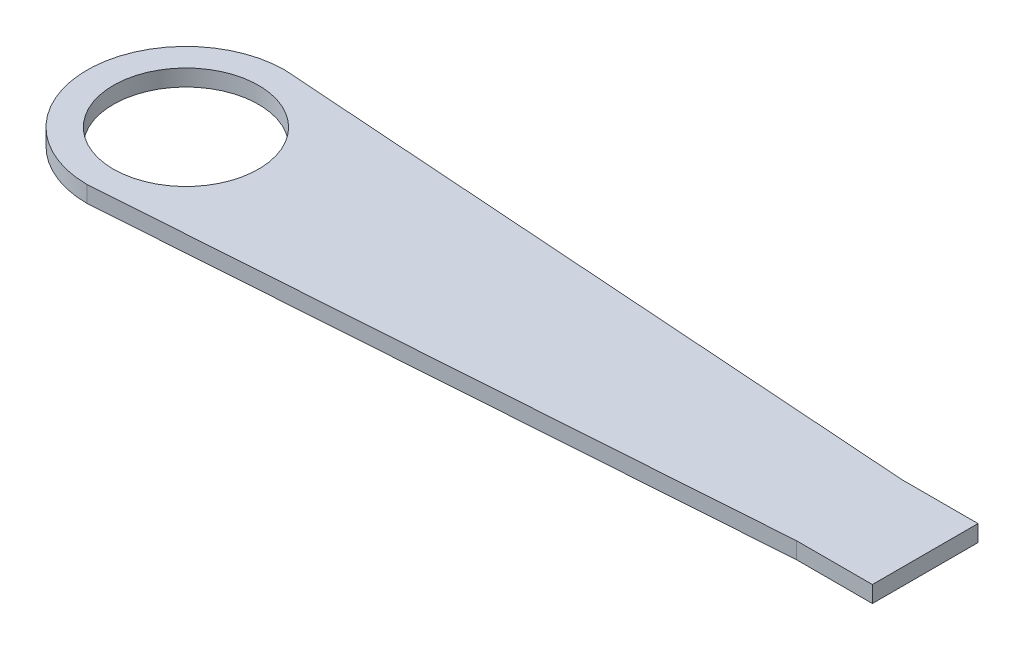
ISO-10303-21;
HEADER;
FILE_DESCRIPTION(('STEP AP214'),'2;1');
FILE_NAME('part.step','',(''),(''),'','','');
FILE_SCHEMA(('AUTOMOTIVE_DESIGN { 1 0 10303 214 1 1 1 1 }'));
ENDSEC;
DATA;
#1=APPLICATION_CONTEXT('core data for automotive mechanical design processes');
#2=APPLICATION_PROTOCOL_DEFINITION('international standard','automotive_design',2000,#1);
#3=PRODUCT_CONTEXT('',#1,'mechanical');
#4=PRODUCT('Part','Part','',(#3));
#5=PRODUCT_RELATED_PRODUCT_CATEGORY('part','',(#4));
#6=PRODUCT_DEFINITION_FORMATION('','',#4);
#7=PRODUCT_DEFINITION_CONTEXT('part definition',#1,'design');
#8=PRODUCT_DEFINITION('design','',#6,#7);
#9=PRODUCT_DEFINITION_SHAPE('','',#8);
#10=(LENGTH_UNIT() NAMED_UNIT(*) SI_UNIT(.MILLI.,.METRE.));
#11=(NAMED_UNIT(*) PLANE_ANGLE_UNIT() SI_UNIT($,.RADIAN.));
#12=(NAMED_UNIT(*) SI_UNIT($,.STERADIAN.) SOLID_ANGLE_UNIT());
#13=UNCERTAINTY_MEASURE_WITH_UNIT(LENGTH_MEASURE(1.E-05),#10,'distance_accuracy_value','');
#14=(GEOMETRIC_REPRESENTATION_CONTEXT(3) GLOBAL_UNCERTAINTY_ASSIGNED_CONTEXT((#13)) GLOBAL_UNIT_ASSIGNED_CONTEXT((#10,
#11,#12)) REPRESENTATION_CONTEXT('',''));
#15=CARTESIAN_POINT('',(0.,0.,0.));
#16=DIRECTION('',(0.,0.,1.));
#17=DIRECTION('',(1.,0.,0.));
#18=AXIS2_PLACEMENT_3D('',#15,#16,#17);
#19=CARTESIAN_POINT('',(0.0544232439942625,0.25,0.78119156863807));
#20=DIRECTION('',(0.0694985119826899,0.,0.997582055187538));
#21=DIRECTION('',(0.997582055187538,0.,-0.0694985119826899));
#22=AXIS2_PLACEMENT_3D('',#19,#20,#21);
#23=PLANE('',#22);
#24=DIRECTION('',(-0.997582055187538,0.,0.0694985119826899));
#25=VECTOR('',#24,1.);
#26=CARTESIAN_POINT('',(0.0544232439942625,0.,0.78119156863807));
#27=LINE('',#26,#25);
#28=CARTESIAN_POINT('',(6.89751681544525,0.,0.304454022988506));
#29=VERTEX_POINT('',#28);
#30=CARTESIAN_POINT('',(-3.15028735632184,0.,1.00445402298851));
#31=VERTEX_POINT('',#30);
#32=EDGE_CURVE('E120',#29,#31,#27,.T.);
#33=ORIENTED_EDGE('',*,*,#32,.F.);
#34=DIRECTION('',(0.,-1.,0.));
#35=VECTOR('',#34,1.);
#36=CARTESIAN_POINT('',(6.89751681544525,0.25,0.304454022988506));
#37=LINE('',#36,#35);
#38=CARTESIAN_POINT('',(6.89751681544525,0.25,0.304454022988506));
#39=VERTEX_POINT('',#38);
#40=EDGE_CURVE('E11',#39,#29,#37,.T.);
#41=ORIENTED_EDGE('',*,*,#40,.F.);
#42=DIRECTION('',(-0.997582055187538,0.,0.0694985119826899));
#43=VECTOR('',#42,1.);
#44=CARTESIAN_POINT('',(0.0544232439942625,0.25,0.78119156863807));
#45=LINE('',#44,#43);
#46=CARTESIAN_POINT('',(-3.15028735632184,0.25,1.00445402298851));
#47=VERTEX_POINT('',#46);
#48=EDGE_CURVE('E137',#39,#47,#45,.T.);
#49=ORIENTED_EDGE('',*,*,#48,.T.);
#50=DIRECTION('',(0.,-1.,0.));
#51=VECTOR('',#50,1.);
#52=CARTESIAN_POINT('',(-3.15028735632184,0.25,1.00445402298851));
#53=LINE('',#52,#51);
#54=EDGE_CURVE('E79',#47,#31,#53,.T.);
#55=ORIENTED_EDGE('',*,*,#54,.T.);
#56=EDGE_LOOP('',(#33,#41,#49,#55));
#57=FACE_BOUND('',#56,.T.);
#58=ADVANCED_FACE('F35',(#57),#23,.T.);
#59=CARTESIAN_POINT('',(0.,0.25,0.304454022988506));
#60=DIRECTION('',(0.,0.,-1.));
#61=DIRECTION('',(-1.,0.,0.));
#62=AXIS2_PLACEMENT_3D('',#59,#60,#61);
#63=PLANE('',#62);
#64=DIRECTION('',(1.,0.,0.));
#65=VECTOR('',#64,1.);
#66=CARTESIAN_POINT('',(0.,0.,0.304454022988506));
#67=LINE('',#66,#65);
#68=CARTESIAN_POINT('',(8.04971264367816,0.,0.304454022988506));
#69=VERTEX_POINT('',#68);
#70=EDGE_CURVE('E123',#29,#69,#67,.T.);
#71=ORIENTED_EDGE('',*,*,#70,.T.);
#72=DIRECTION('',(0.,-1.,0.));
#73=VECTOR('',#72,1.);
#74=CARTESIAN_POINT('',(8.04971264367816,0.25,0.304454022988506));
#75=LINE('',#74,#73);
#76=CARTESIAN_POINT('',(8.04971264367816,0.25,0.304454022988506));
#77=VERTEX_POINT('',#76);
#78=EDGE_CURVE('E43',#77,#69,#75,.T.);
#79=ORIENTED_EDGE('',*,*,#78,.F.);
#80=DIRECTION('',(1.,0.,0.));
#81=VECTOR('',#80,1.);
#82=CARTESIAN_POINT('',(0.,0.25,0.304454022988506));
#83=LINE('',#82,#81);
#84=EDGE_CURVE('E151',#39,#77,#83,.T.);
#85=ORIENTED_EDGE('',*,*,#84,.F.);
#86=ORIENTED_EDGE('',*,*,#40,.T.);
#87=EDGE_LOOP('',(#71,#79,#85,#86));
#88=FACE_BOUND('',#87,.T.);
#89=ADVANCED_FACE('F146',(#88),#63,.F.);
#90=CARTESIAN_POINT('',(8.04971264367816,0.25,0.));
#91=DIRECTION('',(1.,0.,0.));
#92=DIRECTION('',(0.,0.,-1.));
#93=AXIS2_PLACEMENT_3D('',#90,#91,#92);
#94=PLANE('',#93);
#95=DIRECTION('',(0.,0.,1.));
#96=VECTOR('',#95,1.);
#97=CARTESIAN_POINT('',(8.04971264367816,0.,0.));
#98=LINE('',#97,#96);
#99=CARTESIAN_POINT('',(8.04971264367816,0.,-1.29554597701149));
#100=VERTEX_POINT('',#99);
#101=EDGE_CURVE('E126',#100,#69,#98,.T.);
#102=ORIENTED_EDGE('',*,*,#101,.F.);
#103=DIRECTION('',(0.,-1.,0.));
#104=VECTOR('',#103,1.);
#105=CARTESIAN_POINT('',(8.04971264367816,0.25,-1.29554597701149));
#106=LINE('',#105,#104);
#107=CARTESIAN_POINT('',(8.04971264367816,0.25,-1.29554597701149));
#108=VERTEX_POINT('',#107);
#109=EDGE_CURVE('E103',#108,#100,#106,.T.);
#110=ORIENTED_EDGE('',*,*,#109,.F.);
#111=DIRECTION('',(0.,0.,1.));
#112=VECTOR('',#111,1.);
#113=CARTESIAN_POINT('',(8.04971264367816,0.25,0.));
#114=LINE('',#113,#112);
#115=EDGE_CURVE('E110',#108,#77,#114,.T.);
#116=ORIENTED_EDGE('',*,*,#115,.T.);
#117=ORIENTED_EDGE('',*,*,#78,.T.);
#118=EDGE_LOOP('',(#102,#110,#116,#117));
#119=FACE_BOUND('',#118,.T.);
#120=ADVANCED_FACE('F143',(#119),#94,.T.);
#121=CARTESIAN_POINT('',(0.,0.25,-1.29554597701149));
#122=DIRECTION('',(0.,0.,-1.));
#123=DIRECTION('',(-1.,0.,0.));
#124=AXIS2_PLACEMENT_3D('',#121,#122,#123);
#125=PLANE('',#124);
#126=DIRECTION('',(1.,0.,0.));
#127=VECTOR('',#126,1.);
#128=CARTESIAN_POINT('',(0.,0.,-1.29554597701149));
#129=LINE('',#128,#127);
#130=CARTESIAN_POINT('',(6.89751681544525,0.,-1.29554597701149));
#131=VERTEX_POINT('',#130);
#132=EDGE_CURVE('E98',#131,#100,#129,.T.);
#133=ORIENTED_EDGE('',*,*,#132,.F.);
#134=DIRECTION('',(0.,-1.,0.));
#135=VECTOR('',#134,1.);
#136=CARTESIAN_POINT('',(6.89751681544525,0.25,-1.29554597701149));
#137=LINE('',#136,#135);
#138=CARTESIAN_POINT('',(6.89751681544525,0.25,-1.29554597701149));
#139=VERTEX_POINT('',#138);
#140=EDGE_CURVE('E93',#139,#131,#137,.T.);
#141=ORIENTED_EDGE('',*,*,#140,.F.);
#142=DIRECTION('',(1.,0.,0.));
#143=VECTOR('',#142,1.);
#144=CARTESIAN_POINT('',(0.,0.25,-1.29554597701149));
#145=LINE('',#144,#143);
#146=EDGE_CURVE('E96',#139,#108,#145,.T.);
#147=ORIENTED_EDGE('',*,*,#146,.T.);
#148=ORIENTED_EDGE('',*,*,#109,.T.);
#149=EDGE_LOOP('',(#133,#141,#147,#148));
#150=FACE_BOUND('',#149,.T.);
#151=ADVANCED_FACE('F95',(#150),#125,.T.);
#152=CARTESIAN_POINT('',(0.123136113410171,0.25,-1.76749650573986));
#153=DIRECTION('',(0.0694985119826899,0.,-0.997582055187538));
#154=DIRECTION('',(-0.997582055187538,0.,-0.0694985119826899));
#155=AXIS2_PLACEMENT_3D('',#152,#153,#154);
#156=PLANE('',#155);
#157=DIRECTION('',(0.997582055187538,0.,0.0694985119826899));
#158=VECTOR('',#157,1.);
#159=CARTESIAN_POINT('',(0.123136113410171,0.,-1.76749650573986));
#160=LINE('',#159,#158);
#161=CARTESIAN_POINT('',(-3.15028735632184,0.,-1.99554597701149));
#162=VERTEX_POINT('',#161);
#163=EDGE_CURVE('E130',#162,#131,#160,.T.);
#164=ORIENTED_EDGE('',*,*,#163,.F.);
#165=DIRECTION('',(0.,-1.,0.));
#166=VECTOR('',#165,1.);
#167=CARTESIAN_POINT('',(-3.15028735632184,0.25,-1.99554597701149));
#168=LINE('',#167,#166);
#169=CARTESIAN_POINT('',(-3.15028735632184,0.25,-1.99554597701149));
#170=VERTEX_POINT('',#169);
#171=EDGE_CURVE('E72',#170,#162,#168,.T.);
#172=ORIENTED_EDGE('',*,*,#171,.F.);
#173=DIRECTION('',(0.997582055187538,0.,0.0694985119826899));
#174=VECTOR('',#173,1.);
#175=CARTESIAN_POINT('',(0.123136113410171,0.25,-1.76749650573986));
#176=LINE('',#175,#174);
#177=EDGE_CURVE('E108',#170,#139,#176,.T.);
#178=ORIENTED_EDGE('',*,*,#177,.T.);
#179=ORIENTED_EDGE('',*,*,#140,.T.);
#180=EDGE_LOOP('',(#164,#172,#178,#179));
#181=FACE_BOUND('',#180,.T.);
#182=ADVANCED_FACE('F112',(#181),#156,.T.);
#183=CARTESIAN_POINT('',(-3.15028735632184,0.25,-0.495545977011494));
#184=DIRECTION('',(0.,-1.,0.));
#185=DIRECTION('',(0.,0.,-1.));
#186=AXIS2_PLACEMENT_3D('',#183,#184,#185);
#187=CYLINDRICAL_SURFACE('',#186,1.5);
#188=CARTESIAN_POINT('',(-3.15028735632184,0.,-0.495545977011494));
#189=DIRECTION('',(0.,1.,0.));
#190=DIRECTION('',(0.,0.,1.));
#191=AXIS2_PLACEMENT_3D('',#188,#189,#190);
#192=CIRCLE('',#191,1.5);
#193=EDGE_CURVE('E132',#162,#31,#192,.T.);
#194=ORIENTED_EDGE('',*,*,#193,.T.);
#195=ORIENTED_EDGE('',*,*,#54,.F.);
#196=CARTESIAN_POINT('',(-3.15028735632184,0.25,-0.495545977011494));
#197=DIRECTION('',(0.,1.,0.));
#198=DIRECTION('',(0.,0.,1.));
#199=AXIS2_PLACEMENT_3D('',#196,#197,#198);
#200=CIRCLE('',#199,1.5);
#201=EDGE_CURVE('E51',#170,#47,#200,.T.);
#202=ORIENTED_EDGE('',*,*,#201,.F.);
#203=ORIENTED_EDGE('',*,*,#171,.T.);
#204=EDGE_LOOP('',(#194,#195,#202,#203));
#205=FACE_BOUND('',#204,.T.);
#206=ADVANCED_FACE('F150',(#205),#187,.T.);
#207=CARTESIAN_POINT('',(-3.15028735632184,0.25,-0.495545977011494));
#208=DIRECTION('',(0.,-1.,0.));
#209=DIRECTION('',(0.,0.,-1.));
#210=AXIS2_PLACEMENT_3D('',#207,#208,#209);
#211=CYLINDRICAL_SURFACE('',#210,1.1);
#212=CARTESIAN_POINT('',(-3.15028735632184,0.25,-0.495545977011494));
#213=DIRECTION('',(0.,1.,0.));
#214=DIRECTION('',(0.,0.,1.));
#215=AXIS2_PLACEMENT_3D('',#212,#213,#214);
#216=CIRCLE('',#215,1.1);
#217=CARTESIAN_POINT('',(-3.15028735632184,0.25,0.604454022988506));
#218=VERTEX_POINT('',#217);
#219=EDGE_CURVE('E114',#218,#218,#216,.T.);
#220=ORIENTED_EDGE('',*,*,#219,.T.);
#221=EDGE_LOOP('',(#220));
#222=FACE_BOUND('',#221,.T.);
#223=CARTESIAN_POINT('',(-3.15028735632184,0.,-0.495545977011494));
#224=DIRECTION('',(0.,1.,0.));
#225=DIRECTION('',(0.,0.,1.));
#226=AXIS2_PLACEMENT_3D('',#223,#224,#225);
#227=CIRCLE('',#226,1.1);
#228=CARTESIAN_POINT('',(-3.15028735632184,0.,0.604454022988506));
#229=VERTEX_POINT('',#228);
#230=EDGE_CURVE('E134',#229,#229,#227,.T.);
#231=ORIENTED_EDGE('',*,*,#230,.F.);
#232=EDGE_LOOP('',(#231));
#233=FACE_BOUND('',#232,.T.);
#234=ADVANCED_FACE('F169',(#222,#233),#211,.F.);
#235=CARTESIAN_POINT('',(0.,0.25,0.));
#236=DIRECTION('',(0.,1.,0.));
#237=DIRECTION('',(0.,0.,1.));
#238=AXIS2_PLACEMENT_3D('',#235,#236,#237);
#239=PLANE('',#238);
#240=ORIENTED_EDGE('',*,*,#48,.F.);
#241=ORIENTED_EDGE('',*,*,#84,.T.);
#242=ORIENTED_EDGE('',*,*,#115,.F.);
#243=ORIENTED_EDGE('',*,*,#146,.F.);
#244=ORIENTED_EDGE('',*,*,#177,.F.);
#245=ORIENTED_EDGE('',*,*,#201,.T.);
#246=EDGE_LOOP('',(#240,#241,#242,#243,#244,#245));
#247=FACE_BOUND('',#246,.T.);
#248=ORIENTED_EDGE('',*,*,#219,.F.);
#249=EDGE_LOOP('',(#248));
#250=FACE_BOUND('',#249,.T.);
#251=ADVANCED_FACE('F106',(#247,#250),#239,.T.);
#252=CARTESIAN_POINT('',(0.,0.,0.));
#253=DIRECTION('',(0.,1.,0.));
#254=DIRECTION('',(0.,0.,1.));
#255=AXIS2_PLACEMENT_3D('',#252,#253,#254);
#256=PLANE('',#255);
#257=ORIENTED_EDGE('',*,*,#32,.T.);
#258=ORIENTED_EDGE('',*,*,#193,.F.);
#259=ORIENTED_EDGE('',*,*,#163,.T.);
#260=ORIENTED_EDGE('',*,*,#132,.T.);
#261=ORIENTED_EDGE('',*,*,#101,.T.);
#262=ORIENTED_EDGE('',*,*,#70,.F.);
#263=EDGE_LOOP('',(#257,#258,#259,#260,#261,#262));
#264=FACE_BOUND('',#263,.T.);
#265=ORIENTED_EDGE('',*,*,#230,.T.);
#266=EDGE_LOOP('',(#265));
#267=FACE_BOUND('',#266,.T.);
#268=ADVANCED_FACE('F148',(#264,#267),#256,.F.);
#269=CLOSED_SHELL('',(#58,#89,#120,#151,#182,#206,#234,#251,#268));
#270=MANIFOLD_SOLID_BREP('B2',#269);
#271=ADVANCED_BREP_SHAPE_REPRESENTATION('',(#18,#270),#14);
#272=SHAPE_DEFINITION_REPRESENTATION(#9,#271);
ENDSEC;
END-ISO-10303-21;
